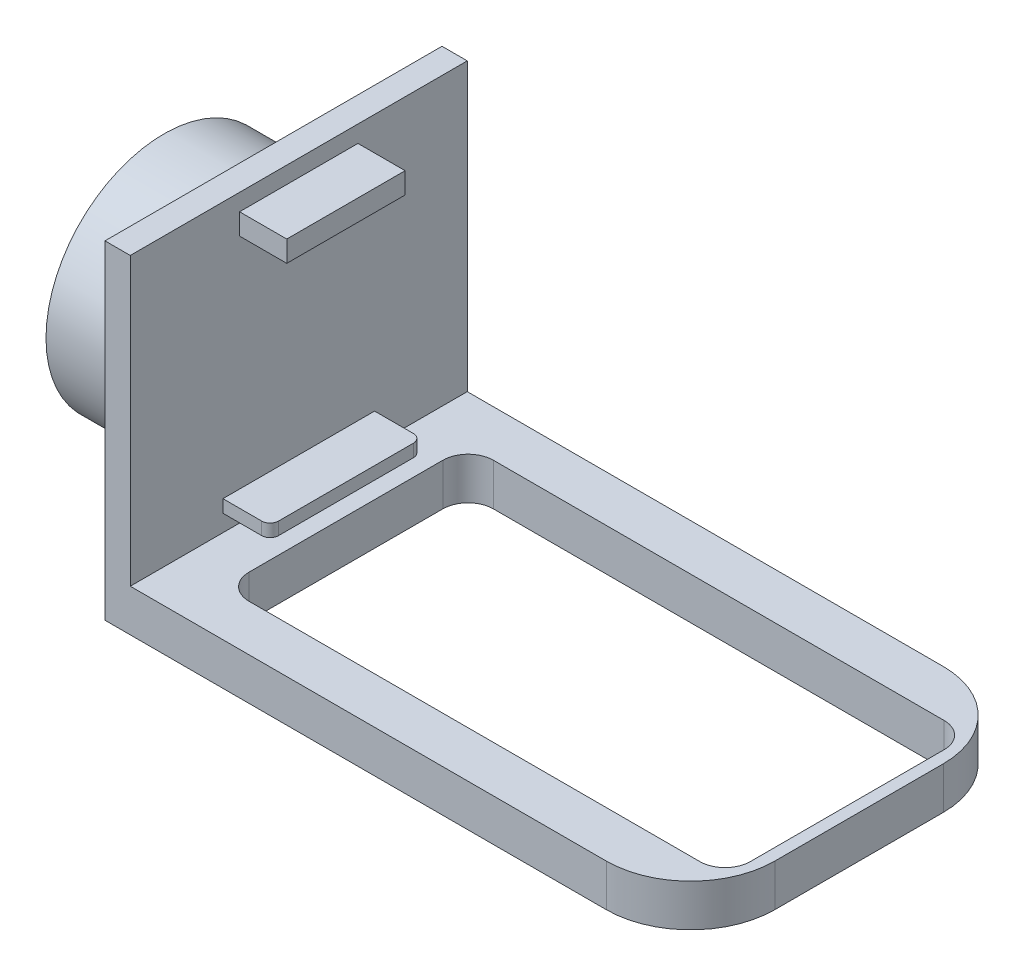
ISO-10303-21;
HEADER;
FILE_DESCRIPTION(('STEP AP214'),'2;1');
FILE_NAME('part.step','',(''),(''),'','','');
FILE_SCHEMA(('AUTOMOTIVE_DESIGN { 1 0 10303 214 1 1 1 1 }'));
ENDSEC;
DATA;
#1=APPLICATION_CONTEXT('core data for automotive mechanical design processes');
#2=APPLICATION_PROTOCOL_DEFINITION('international standard','automotive_design',2000,#1);
#3=PRODUCT_CONTEXT('',#1,'mechanical');
#4=PRODUCT('Part','Part','',(#3));
#5=PRODUCT_RELATED_PRODUCT_CATEGORY('part','',(#4));
#6=PRODUCT_DEFINITION_FORMATION('','',#4);
#7=PRODUCT_DEFINITION_CONTEXT('part definition',#1,'design');
#8=PRODUCT_DEFINITION('design','',#6,#7);
#9=PRODUCT_DEFINITION_SHAPE('','',#8);
#10=(LENGTH_UNIT() NAMED_UNIT(*) SI_UNIT(.MILLI.,.METRE.));
#11=(NAMED_UNIT(*) PLANE_ANGLE_UNIT() SI_UNIT($,.RADIAN.));
#12=(NAMED_UNIT(*) SI_UNIT($,.STERADIAN.) SOLID_ANGLE_UNIT());
#13=UNCERTAINTY_MEASURE_WITH_UNIT(LENGTH_MEASURE(1.E-05),#10,'distance_accuracy_value','');
#14=(GEOMETRIC_REPRESENTATION_CONTEXT(3) GLOBAL_UNCERTAINTY_ASSIGNED_CONTEXT((#13)) GLOBAL_UNIT_ASSIGNED_CONTEXT((#10,
#11,#12)) REPRESENTATION_CONTEXT('',''));
#15=CARTESIAN_POINT('',(0.,0.,0.));
#16=DIRECTION('',(0.,0.,1.));
#17=DIRECTION('',(1.,0.,0.));
#18=AXIS2_PLACEMENT_3D('',#15,#16,#17);
#19=CARTESIAN_POINT('',(-33.25,0.,0.));
#20=DIRECTION('',(-1.,0.,0.));
#21=DIRECTION('',(0.,0.,1.));
#22=AXIS2_PLACEMENT_3D('',#19,#20,#21);
#23=PLANE('',#22);
#24=DIRECTION('',(0.,-1.,0.));
#25=VECTOR('',#24,1.);
#26=CARTESIAN_POINT('',(-33.25,37.,7.025));
#27=LINE('',#26,#25);
#28=CARTESIAN_POINT('',(-33.25,37.,7.025));
#29=VERTEX_POINT('',#28);
#30=CARTESIAN_POINT('',(-33.25,34.5,7.025));
#31=VERTEX_POINT('',#30);
#32=EDGE_CURVE('E235',#29,#31,#27,.T.);
#33=ORIENTED_EDGE('',*,*,#32,.F.);
#34=DIRECTION('',(0.,0.,1.));
#35=VECTOR('',#34,1.);
#36=CARTESIAN_POINT('',(-33.25,37.,0.));
#37=LINE('',#36,#35);
#38=CARTESIAN_POINT('',(-33.25,37.,-7.025));
#39=VERTEX_POINT('',#38);
#40=EDGE_CURVE('E251',#39,#29,#37,.T.);
#41=ORIENTED_EDGE('',*,*,#40,.F.);
#42=DIRECTION('',(0.,1.,0.));
#43=VECTOR('',#42,1.);
#44=CARTESIAN_POINT('',(-33.25,34.5,-7.025));
#45=LINE('',#44,#43);
#46=CARTESIAN_POINT('',(-33.25,34.5,-7.025));
#47=VERTEX_POINT('',#46);
#48=EDGE_CURVE('E261',#47,#39,#45,.T.);
#49=ORIENTED_EDGE('',*,*,#48,.F.);
#50=DIRECTION('',(0.,0.,-1.));
#51=VECTOR('',#50,1.);
#52=CARTESIAN_POINT('',(-33.25,34.5,7.025));
#53=LINE('',#52,#51);
#54=EDGE_CURVE('E239',#31,#47,#53,.T.);
#55=ORIENTED_EDGE('',*,*,#54,.F.);
#56=EDGE_LOOP('',(#33,#41,#49,#55));
#57=FACE_BOUND('',#56,.T.);
#58=DIRECTION('',(0.,0.,1.));
#59=VECTOR('',#58,1.);
#60=CARTESIAN_POINT('',(-33.25,5.,20.));
#61=LINE('',#60,#59);
#62=CARTESIAN_POINT('',(-33.25,5.,-20.));
#63=VERTEX_POINT('',#62);
#64=CARTESIAN_POINT('',(-33.25,5.,20.));
#65=VERTEX_POINT('',#64);
#66=EDGE_CURVE('E366',#63,#65,#61,.T.);
#67=ORIENTED_EDGE('',*,*,#66,.F.);
#68=DIRECTION('',(0.,-1.,0.));
#69=VECTOR('',#68,1.);
#70=CARTESIAN_POINT('',(-33.25,0.,-20.));
#71=LINE('',#70,#69);
#72=CARTESIAN_POINT('',(-33.25,39.,-20.));
#73=VERTEX_POINT('',#72);
#74=EDGE_CURVE('E282',#73,#63,#71,.T.);
#75=ORIENTED_EDGE('',*,*,#74,.F.);
#76=DIRECTION('',(0.,0.,-1.));
#77=VECTOR('',#76,1.);
#78=CARTESIAN_POINT('',(-33.25,39.,20.));
#79=LINE('',#78,#77);
#80=CARTESIAN_POINT('',(-33.25,39.,20.));
#81=VERTEX_POINT('',#80);
#82=EDGE_CURVE('E292',#81,#73,#79,.T.);
#83=ORIENTED_EDGE('',*,*,#82,.F.);
#84=DIRECTION('',(0.,1.,0.));
#85=VECTOR('',#84,1.);
#86=CARTESIAN_POINT('',(-33.25,0.,20.));
#87=LINE('',#86,#85);
#88=EDGE_CURVE('E277',#65,#81,#87,.T.);
#89=ORIENTED_EDGE('',*,*,#88,.F.);
#90=EDGE_LOOP('',(#67,#75,#83,#89));
#91=FACE_BOUND('',#90,.T.);
#92=DIRECTION('',(0.,0.,-1.));
#93=VECTOR('',#92,1.);
#94=CARTESIAN_POINT('',(-33.25,7.,0.));
#95=LINE('',#94,#93);
#96=CARTESIAN_POINT('',(-33.25,7.,9.));
#97=VERTEX_POINT('',#96);
#98=CARTESIAN_POINT('',(-33.25,7.,-9.));
#99=VERTEX_POINT('',#98);
#100=EDGE_CURVE('E215',#97,#99,#95,.T.);
#101=ORIENTED_EDGE('',*,*,#100,.F.);
#102=DIRECTION('',(0.,-1.,0.));
#103=VECTOR('',#102,1.);
#104=CARTESIAN_POINT('',(-33.25,8.5,9.));
#105=LINE('',#104,#103);
#106=CARTESIAN_POINT('',(-33.25,8.5,9.));
#107=VERTEX_POINT('',#106);
#108=EDGE_CURVE('E227',#107,#97,#105,.T.);
#109=ORIENTED_EDGE('',*,*,#108,.F.);
#110=DIRECTION('',(0.,0.,1.));
#111=VECTOR('',#110,1.);
#112=CARTESIAN_POINT('',(-33.25,8.5,-9.));
#113=LINE('',#112,#111);
#114=CARTESIAN_POINT('',(-33.25,8.5,-9.));
#115=VERTEX_POINT('',#114);
#116=EDGE_CURVE('E236',#115,#107,#113,.T.);
#117=ORIENTED_EDGE('',*,*,#116,.F.);
#118=DIRECTION('',(0.,1.,0.));
#119=VECTOR('',#118,1.);
#120=CARTESIAN_POINT('',(-33.25,7.,-9.));
#121=LINE('',#120,#119);
#122=EDGE_CURVE('E230',#99,#115,#121,.T.);
#123=ORIENTED_EDGE('',*,*,#122,.F.);
#124=EDGE_LOOP('',(#101,#109,#117,#123));
#125=FACE_BOUND('',#124,.T.);
#126=ADVANCED_FACE('F34',(#57,#91,#125),#23,.F.);
#127=CARTESIAN_POINT('',(0.,5.,0.));
#128=DIRECTION('',(0.,-1.,0.));
#129=DIRECTION('',(0.,0.,-1.));
#130=AXIS2_PLACEMENT_3D('',#127,#128,#129);
#131=PLANE('',#130);
#132=DIRECTION('',(1.,0.,0.));
#133=VECTOR('',#132,1.);
#134=CARTESIAN_POINT('',(-33.25,5.,20.));
#135=LINE('',#134,#133);
#136=CARTESIAN_POINT('',(23.25,5.,20.));
#137=VERTEX_POINT('',#136);
#138=EDGE_CURVE('E369',#65,#137,#135,.T.);
#139=ORIENTED_EDGE('',*,*,#138,.T.);
#140=CARTESIAN_POINT('',(23.25,5.,10.));
#141=DIRECTION('',(0.,-1.,0.));
#142=DIRECTION('',(0.,0.,-1.));
#143=AXIS2_PLACEMENT_3D('',#140,#141,#142);
#144=CIRCLE('',#143,10.);
#145=CARTESIAN_POINT('',(33.25,5.,10.));
#146=VERTEX_POINT('',#145);
#147=EDGE_CURVE('E42',#137,#146,#144,.F.);
#148=ORIENTED_EDGE('',*,*,#147,.T.);
#149=DIRECTION('',(0.,0.,-1.));
#150=VECTOR('',#149,1.);
#151=CARTESIAN_POINT('',(33.25,5.,20.));
#152=LINE('',#151,#150);
#153=CARTESIAN_POINT('',(33.25,5.,-10.));
#154=VERTEX_POINT('',#153);
#155=EDGE_CURVE('E361',#146,#154,#152,.T.);
#156=ORIENTED_EDGE('',*,*,#155,.T.);
#157=CARTESIAN_POINT('',(23.25,5.,-10.));
#158=DIRECTION('',(0.,-1.,0.));
#159=DIRECTION('',(0.,0.,-1.));
#160=AXIS2_PLACEMENT_3D('',#157,#158,#159);
#161=CIRCLE('',#160,10.);
#162=CARTESIAN_POINT('',(23.25,5.,-20.));
#163=VERTEX_POINT('',#162);
#164=EDGE_CURVE('E49',#154,#163,#161,.F.);
#165=ORIENTED_EDGE('',*,*,#164,.T.);
#166=DIRECTION('',(-1.,0.,0.));
#167=VECTOR('',#166,1.);
#168=CARTESIAN_POINT('',(-33.25,5.,-20.));
#169=LINE('',#168,#167);
#170=EDGE_CURVE('E363',#163,#63,#169,.T.);
#171=ORIENTED_EDGE('',*,*,#170,.T.);
#172=ORIENTED_EDGE('',*,*,#66,.T.);
#173=EDGE_LOOP('',(#139,#148,#156,#165,#171,#172));
#174=FACE_BOUND('',#173,.T.);
#175=CARTESIAN_POINT('',(28.85,5.,11.5));
#176=DIRECTION('',(0.,1.,0.));
#177=DIRECTION('',(0.,0.,-1.));
#178=AXIS2_PLACEMENT_3D('',#175,#176,#177);
#179=CIRCLE('',#178,3.);
#180=CARTESIAN_POINT('',(28.85,5.,14.5));
#181=VERTEX_POINT('',#180);
#182=CARTESIAN_POINT('',(31.85,5.,11.5));
#183=VERTEX_POINT('',#182);
#184=EDGE_CURVE('E302',#181,#183,#179,.T.);
#185=ORIENTED_EDGE('',*,*,#184,.F.);
#186=DIRECTION('',(1.,0.,0.));
#187=VECTOR('',#186,1.);
#188=CARTESIAN_POINT('',(28.85,5.,14.5));
#189=LINE('',#188,#187);
#190=CARTESIAN_POINT('',(-24.65,5.,14.5));
#191=VERTEX_POINT('',#190);
#192=EDGE_CURVE('E318',#191,#181,#189,.T.);
#193=ORIENTED_EDGE('',*,*,#192,.F.);
#194=CARTESIAN_POINT('',(-24.65,5.,11.5));
#195=DIRECTION('',(0.,1.,0.));
#196=DIRECTION('',(0.,0.,1.));
#197=AXIS2_PLACEMENT_3D('',#194,#195,#196);
#198=CIRCLE('',#197,3.);
#199=CARTESIAN_POINT('',(-27.65,5.,11.5));
#200=VERTEX_POINT('',#199);
#201=EDGE_CURVE('E315',#200,#191,#198,.T.);
#202=ORIENTED_EDGE('',*,*,#201,.F.);
#203=DIRECTION('',(0.,0.,1.));
#204=VECTOR('',#203,1.);
#205=CARTESIAN_POINT('',(-27.65,5.,-11.5));
#206=LINE('',#205,#204);
#207=CARTESIAN_POINT('',(-27.65,5.,-11.5));
#208=VERTEX_POINT('',#207);
#209=EDGE_CURVE('E313',#208,#200,#206,.T.);
#210=ORIENTED_EDGE('',*,*,#209,.F.);
#211=CARTESIAN_POINT('',(-24.65,5.,-11.5));
#212=DIRECTION('',(0.,1.,0.));
#213=DIRECTION('',(0.,0.,-1.));
#214=AXIS2_PLACEMENT_3D('',#211,#212,#213);
#215=CIRCLE('',#214,3.);
#216=CARTESIAN_POINT('',(-24.65,5.,-14.5));
#217=VERTEX_POINT('',#216);
#218=EDGE_CURVE('E311',#217,#208,#215,.T.);
#219=ORIENTED_EDGE('',*,*,#218,.F.);
#220=DIRECTION('',(-1.,0.,0.));
#221=VECTOR('',#220,1.);
#222=CARTESIAN_POINT('',(-24.65,5.,-14.5));
#223=LINE('',#222,#221);
#224=CARTESIAN_POINT('',(28.85,5.,-14.5));
#225=VERTEX_POINT('',#224);
#226=EDGE_CURVE('E309',#225,#217,#223,.T.);
#227=ORIENTED_EDGE('',*,*,#226,.F.);
#228=CARTESIAN_POINT('',(28.85,5.,-11.5));
#229=DIRECTION('',(0.,1.,0.));
#230=DIRECTION('',(0.,0.,-1.));
#231=AXIS2_PLACEMENT_3D('',#228,#229,#230);
#232=CIRCLE('',#231,3.);
#233=CARTESIAN_POINT('',(31.85,5.,-11.5));
#234=VERTEX_POINT('',#233);
#235=EDGE_CURVE('E307',#234,#225,#232,.T.);
#236=ORIENTED_EDGE('',*,*,#235,.F.);
#237=DIRECTION('',(0.,0.,-1.));
#238=VECTOR('',#237,1.);
#239=CARTESIAN_POINT('',(31.85,5.,-11.5));
#240=LINE('',#239,#238);
#241=EDGE_CURVE('E304',#183,#234,#240,.T.);
#242=ORIENTED_EDGE('',*,*,#241,.F.);
#243=EDGE_LOOP('',(#185,#193,#202,#210,#219,#227,#236,#242));
#244=FACE_BOUND('',#243,.T.);
#245=ADVANCED_FACE('F405',(#174,#244),#131,.F.);
#246=CARTESIAN_POINT('',(0.,0.,0.));
#247=DIRECTION('',(0.,-1.,0.));
#248=DIRECTION('',(0.,0.,-1.));
#249=AXIS2_PLACEMENT_3D('',#246,#247,#248);
#250=PLANE('',#249);
#251=DIRECTION('',(0.,0.,-1.));
#252=VECTOR('',#251,1.);
#253=CARTESIAN_POINT('',(33.25,0.,20.));
#254=LINE('',#253,#252);
#255=CARTESIAN_POINT('',(33.25,0.,10.));
#256=VERTEX_POINT('',#255);
#257=CARTESIAN_POINT('',(33.25,0.,-10.));
#258=VERTEX_POINT('',#257);
#259=EDGE_CURVE('E360',#256,#258,#254,.T.);
#260=ORIENTED_EDGE('',*,*,#259,.F.);
#261=CARTESIAN_POINT('',(23.25,0.,10.));
#262=DIRECTION('',(0.,-1.,0.));
#263=DIRECTION('',(0.,0.,-1.));
#264=AXIS2_PLACEMENT_3D('',#261,#262,#263);
#265=CIRCLE('',#264,10.);
#266=CARTESIAN_POINT('',(23.25,0.,20.));
#267=VERTEX_POINT('',#266);
#268=EDGE_CURVE('E400',#256,#267,#265,.T.);
#269=ORIENTED_EDGE('',*,*,#268,.T.);
#270=DIRECTION('',(1.,0.,0.));
#271=VECTOR('',#270,1.);
#272=CARTESIAN_POINT('',(-33.25,0.,20.));
#273=LINE('',#272,#271);
#274=CARTESIAN_POINT('',(-36.25,0.,20.));
#275=VERTEX_POINT('',#274);
#276=EDGE_CURVE('E364',#275,#267,#273,.T.);
#277=ORIENTED_EDGE('',*,*,#276,.F.);
#278=DIRECTION('',(0.,0.,1.));
#279=VECTOR('',#278,1.);
#280=CARTESIAN_POINT('',(-36.25,0.,20.));
#281=LINE('',#280,#279);
#282=CARTESIAN_POINT('',(-36.25,0.,-20.));
#283=VERTEX_POINT('',#282);
#284=EDGE_CURVE('E287',#283,#275,#281,.T.);
#285=ORIENTED_EDGE('',*,*,#284,.F.);
#286=DIRECTION('',(-1.,0.,0.));
#287=VECTOR('',#286,1.);
#288=CARTESIAN_POINT('',(-33.25,0.,-20.));
#289=LINE('',#288,#287);
#290=CARTESIAN_POINT('',(23.25,0.,-20.));
#291=VERTEX_POINT('',#290);
#292=EDGE_CURVE('E374',#291,#283,#289,.T.);
#293=ORIENTED_EDGE('',*,*,#292,.F.);
#294=CARTESIAN_POINT('',(23.25,0.,-10.));
#295=DIRECTION('',(0.,-1.,0.));
#296=DIRECTION('',(0.,0.,-1.));
#297=AXIS2_PLACEMENT_3D('',#294,#295,#296);
#298=CIRCLE('',#297,10.);
#299=EDGE_CURVE('E398',#291,#258,#298,.T.);
#300=ORIENTED_EDGE('',*,*,#299,.T.);
#301=EDGE_LOOP('',(#260,#269,#277,#285,#293,#300));
#302=FACE_BOUND('',#301,.T.);
#303=DIRECTION('',(1.,0.,0.));
#304=VECTOR('',#303,1.);
#305=CARTESIAN_POINT('',(28.85,0.,14.5));
#306=LINE('',#305,#304);
#307=CARTESIAN_POINT('',(-24.65,0.,14.5));
#308=VERTEX_POINT('',#307);
#309=CARTESIAN_POINT('',(28.85,0.,14.5));
#310=VERTEX_POINT('',#309);
#311=EDGE_CURVE('E305',#308,#310,#306,.T.);
#312=ORIENTED_EDGE('',*,*,#311,.T.);
#313=CARTESIAN_POINT('',(28.85,0.,11.5));
#314=DIRECTION('',(0.,1.,0.));
#315=DIRECTION('',(0.,0.,-1.));
#316=AXIS2_PLACEMENT_3D('',#313,#314,#315);
#317=CIRCLE('',#316,3.);
#318=CARTESIAN_POINT('',(31.85,0.,11.5));
#319=VERTEX_POINT('',#318);
#320=EDGE_CURVE('E301',#310,#319,#317,.T.);
#321=ORIENTED_EDGE('',*,*,#320,.T.);
#322=DIRECTION('',(0.,0.,-1.));
#323=VECTOR('',#322,1.);
#324=CARTESIAN_POINT('',(31.85,0.,-11.5));
#325=LINE('',#324,#323);
#326=CARTESIAN_POINT('',(31.85,0.,-11.5));
#327=VERTEX_POINT('',#326);
#328=EDGE_CURVE('E323',#319,#327,#325,.T.);
#329=ORIENTED_EDGE('',*,*,#328,.T.);
#330=CARTESIAN_POINT('',(28.85,0.,-11.5));
#331=DIRECTION('',(0.,1.,0.));
#332=DIRECTION('',(0.,0.,-1.));
#333=AXIS2_PLACEMENT_3D('',#330,#331,#332);
#334=CIRCLE('',#333,3.);
#335=CARTESIAN_POINT('',(28.85,0.,-14.5));
#336=VERTEX_POINT('',#335);
#337=EDGE_CURVE('E326',#327,#336,#334,.T.);
#338=ORIENTED_EDGE('',*,*,#337,.T.);
#339=DIRECTION('',(-1.,0.,0.));
#340=VECTOR('',#339,1.);
#341=CARTESIAN_POINT('',(-24.65,0.,-14.5));
#342=LINE('',#341,#340);
#343=CARTESIAN_POINT('',(-24.65,0.,-14.5));
#344=VERTEX_POINT('',#343);
#345=EDGE_CURVE('E329',#336,#344,#342,.T.);
#346=ORIENTED_EDGE('',*,*,#345,.T.);
#347=CARTESIAN_POINT('',(-24.65,0.,-11.5));
#348=DIRECTION('',(0.,1.,0.));
#349=DIRECTION('',(0.,0.,-1.));
#350=AXIS2_PLACEMENT_3D('',#347,#348,#349);
#351=CIRCLE('',#350,3.);
#352=CARTESIAN_POINT('',(-27.65,0.,-11.5));
#353=VERTEX_POINT('',#352);
#354=EDGE_CURVE('E332',#344,#353,#351,.T.);
#355=ORIENTED_EDGE('',*,*,#354,.T.);
#356=DIRECTION('',(0.,0.,1.));
#357=VECTOR('',#356,1.);
#358=CARTESIAN_POINT('',(-27.65,0.,-11.5));
#359=LINE('',#358,#357);
#360=CARTESIAN_POINT('',(-27.65,0.,11.5));
#361=VERTEX_POINT('',#360);
#362=EDGE_CURVE('E335',#353,#361,#359,.T.);
#363=ORIENTED_EDGE('',*,*,#362,.T.);
#364=CARTESIAN_POINT('',(-24.65,0.,11.5));
#365=DIRECTION('',(0.,1.,0.));
#366=DIRECTION('',(0.,0.,1.));
#367=AXIS2_PLACEMENT_3D('',#364,#365,#366);
#368=CIRCLE('',#367,3.);
#369=EDGE_CURVE('E338',#361,#308,#368,.T.);
#370=ORIENTED_EDGE('',*,*,#369,.T.);
#371=EDGE_LOOP('',(#312,#321,#329,#338,#346,#355,#363,#370));
#372=FACE_BOUND('',#371,.T.);
#373=ADVANCED_FACE('F415',(#302,#372),#250,.T.);
#374=CARTESIAN_POINT('',(33.25,5.,20.));
#375=DIRECTION('',(-1.,0.,0.));
#376=DIRECTION('',(0.,0.,1.));
#377=AXIS2_PLACEMENT_3D('',#374,#375,#376);
#378=PLANE('',#377);
#379=ORIENTED_EDGE('',*,*,#155,.F.);
#380=DIRECTION('',(0.,-1.,0.));
#381=VECTOR('',#380,1.);
#382=CARTESIAN_POINT('',(33.25,5.,10.));
#383=LINE('',#382,#381);
#384=EDGE_CURVE('E395',#146,#256,#383,.T.);
#385=ORIENTED_EDGE('',*,*,#384,.T.);
#386=ORIENTED_EDGE('',*,*,#259,.T.);
#387=DIRECTION('',(0.,-1.,0.));
#388=VECTOR('',#387,1.);
#389=CARTESIAN_POINT('',(33.25,5.,-10.));
#390=LINE('',#389,#388);
#391=EDGE_CURVE('E393',#258,#154,#390,.F.);
#392=ORIENTED_EDGE('',*,*,#391,.T.);
#393=EDGE_LOOP('',(#379,#385,#386,#392));
#394=FACE_BOUND('',#393,.T.);
#395=ADVANCED_FACE('F410',(#394),#378,.F.);
#396=CARTESIAN_POINT('',(-33.25,5.,-20.));
#397=DIRECTION('',(0.,0.,1.));
#398=DIRECTION('',(1.,0.,0.));
#399=AXIS2_PLACEMENT_3D('',#396,#397,#398);
#400=PLANE('',#399);
#401=ORIENTED_EDGE('',*,*,#170,.F.);
#402=DIRECTION('',(0.,-1.,0.));
#403=VECTOR('',#402,1.);
#404=CARTESIAN_POINT('',(23.25,5.,-20.));
#405=LINE('',#404,#403);
#406=EDGE_CURVE('E11',#163,#291,#405,.T.);
#407=ORIENTED_EDGE('',*,*,#406,.T.);
#408=ORIENTED_EDGE('',*,*,#292,.T.);
#409=DIRECTION('',(0.,-1.,0.));
#410=VECTOR('',#409,1.);
#411=CARTESIAN_POINT('',(-36.25,0.,-20.));
#412=LINE('',#411,#410);
#413=CARTESIAN_POINT('',(-36.25,39.,-20.));
#414=VERTEX_POINT('',#413);
#415=EDGE_CURVE('E284',#414,#283,#412,.T.);
#416=ORIENTED_EDGE('',*,*,#415,.F.);
#417=DIRECTION('',(1.,0.,0.));
#418=VECTOR('',#417,1.);
#419=CARTESIAN_POINT('',(-36.25,39.,-20.));
#420=LINE('',#419,#418);
#421=EDGE_CURVE('E290',#414,#73,#420,.T.);
#422=ORIENTED_EDGE('',*,*,#421,.T.);
#423=ORIENTED_EDGE('',*,*,#74,.T.);
#424=EDGE_LOOP('',(#401,#407,#408,#416,#422,#423));
#425=FACE_BOUND('',#424,.T.);
#426=ADVANCED_FACE('F427',(#425),#400,.F.);
#427=CARTESIAN_POINT('',(-33.25,5.,20.));
#428=DIRECTION('',(0.,0.,-1.));
#429=DIRECTION('',(-1.,0.,0.));
#430=AXIS2_PLACEMENT_3D('',#427,#428,#429);
#431=PLANE('',#430);
#432=ORIENTED_EDGE('',*,*,#276,.T.);
#433=DIRECTION('',(0.,-1.,0.));
#434=VECTOR('',#433,1.);
#435=CARTESIAN_POINT('',(23.25,5.,20.));
#436=LINE('',#435,#434);
#437=EDGE_CURVE('E57',#267,#137,#436,.F.);
#438=ORIENTED_EDGE('',*,*,#437,.T.);
#439=ORIENTED_EDGE('',*,*,#138,.F.);
#440=ORIENTED_EDGE('',*,*,#88,.T.);
#441=DIRECTION('',(1.,0.,0.));
#442=VECTOR('',#441,1.);
#443=CARTESIAN_POINT('',(-36.25,39.,20.));
#444=LINE('',#443,#442);
#445=CARTESIAN_POINT('',(-36.25,39.,20.));
#446=VERTEX_POINT('',#445);
#447=EDGE_CURVE('E298',#446,#81,#444,.T.);
#448=ORIENTED_EDGE('',*,*,#447,.F.);
#449=DIRECTION('',(0.,1.,0.));
#450=VECTOR('',#449,1.);
#451=CARTESIAN_POINT('',(-36.25,0.,20.));
#452=LINE('',#451,#450);
#453=EDGE_CURVE('E278',#275,#446,#452,.T.);
#454=ORIENTED_EDGE('',*,*,#453,.F.);
#455=EDGE_LOOP('',(#432,#438,#439,#440,#448,#454));
#456=FACE_BOUND('',#455,.T.);
#457=ADVANCED_FACE('F419',(#456),#431,.F.);
#458=CARTESIAN_POINT('',(28.85,5.,11.5));
#459=DIRECTION('',(0.,-1.,0.));
#460=DIRECTION('',(0.,0.,-1.));
#461=AXIS2_PLACEMENT_3D('',#458,#459,#460);
#462=CYLINDRICAL_SURFACE('',#461,3.);
#463=ORIENTED_EDGE('',*,*,#320,.F.);
#464=DIRECTION('',(0.,-1.,0.));
#465=VECTOR('',#464,1.);
#466=CARTESIAN_POINT('',(28.85,5.,14.5));
#467=LINE('',#466,#465);
#468=EDGE_CURVE('E320',#181,#310,#467,.T.);
#469=ORIENTED_EDGE('',*,*,#468,.F.);
#470=ORIENTED_EDGE('',*,*,#184,.T.);
#471=DIRECTION('',(0.,-1.,0.));
#472=VECTOR('',#471,1.);
#473=CARTESIAN_POINT('',(31.85,5.,11.5));
#474=LINE('',#473,#472);
#475=EDGE_CURVE('E357',#183,#319,#474,.T.);
#476=ORIENTED_EDGE('',*,*,#475,.T.);
#477=EDGE_LOOP('',(#463,#469,#470,#476));
#478=FACE_BOUND('',#477,.T.);
#479=ADVANCED_FACE('F482',(#478),#462,.F.);
#480=CARTESIAN_POINT('',(31.85,5.,-11.5));
#481=DIRECTION('',(-1.,0.,0.));
#482=DIRECTION('',(0.,0.,1.));
#483=AXIS2_PLACEMENT_3D('',#480,#481,#482);
#484=PLANE('',#483);
#485=ORIENTED_EDGE('',*,*,#328,.F.);
#486=ORIENTED_EDGE('',*,*,#475,.F.);
#487=ORIENTED_EDGE('',*,*,#241,.T.);
#488=DIRECTION('',(0.,-1.,0.));
#489=VECTOR('',#488,1.);
#490=CARTESIAN_POINT('',(31.85,5.,-11.5));
#491=LINE('',#490,#489);
#492=EDGE_CURVE('E355',#234,#327,#491,.T.);
#493=ORIENTED_EDGE('',*,*,#492,.T.);
#494=EDGE_LOOP('',(#485,#486,#487,#493));
#495=FACE_BOUND('',#494,.T.);
#496=ADVANCED_FACE('F478',(#495),#484,.T.);
#497=CARTESIAN_POINT('',(28.85,5.,-11.5));
#498=DIRECTION('',(0.,-1.,0.));
#499=DIRECTION('',(0.,0.,-1.));
#500=AXIS2_PLACEMENT_3D('',#497,#498,#499);
#501=CYLINDRICAL_SURFACE('',#500,3.);
#502=ORIENTED_EDGE('',*,*,#337,.F.);
#503=ORIENTED_EDGE('',*,*,#492,.F.);
#504=ORIENTED_EDGE('',*,*,#235,.T.);
#505=DIRECTION('',(0.,-1.,0.));
#506=VECTOR('',#505,1.);
#507=CARTESIAN_POINT('',(28.85,5.,-14.5));
#508=LINE('',#507,#506);
#509=EDGE_CURVE('E353',#225,#336,#508,.T.);
#510=ORIENTED_EDGE('',*,*,#509,.T.);
#511=EDGE_LOOP('',(#502,#503,#504,#510));
#512=FACE_BOUND('',#511,.T.);
#513=ADVANCED_FACE('F474',(#512),#501,.F.);
#514=CARTESIAN_POINT('',(-24.65,5.,-14.5));
#515=DIRECTION('',(0.,0.,1.));
#516=DIRECTION('',(1.,0.,0.));
#517=AXIS2_PLACEMENT_3D('',#514,#515,#516);
#518=PLANE('',#517);
#519=ORIENTED_EDGE('',*,*,#345,.F.);
#520=ORIENTED_EDGE('',*,*,#509,.F.);
#521=ORIENTED_EDGE('',*,*,#226,.T.);
#522=DIRECTION('',(0.,-1.,0.));
#523=VECTOR('',#522,1.);
#524=CARTESIAN_POINT('',(-24.65,5.,-14.5));
#525=LINE('',#524,#523);
#526=EDGE_CURVE('E351',#217,#344,#525,.T.);
#527=ORIENTED_EDGE('',*,*,#526,.T.);
#528=EDGE_LOOP('',(#519,#520,#521,#527));
#529=FACE_BOUND('',#528,.T.);
#530=ADVANCED_FACE('F470',(#529),#518,.T.);
#531=CARTESIAN_POINT('',(-24.65,5.,-11.5));
#532=DIRECTION('',(0.,-1.,0.));
#533=DIRECTION('',(0.,0.,-1.));
#534=AXIS2_PLACEMENT_3D('',#531,#532,#533);
#535=CYLINDRICAL_SURFACE('',#534,3.);
#536=ORIENTED_EDGE('',*,*,#354,.F.);
#537=ORIENTED_EDGE('',*,*,#526,.F.);
#538=ORIENTED_EDGE('',*,*,#218,.T.);
#539=DIRECTION('',(0.,-1.,0.));
#540=VECTOR('',#539,1.);
#541=CARTESIAN_POINT('',(-27.65,5.,-11.5));
#542=LINE('',#541,#540);
#543=EDGE_CURVE('E349',#208,#353,#542,.T.);
#544=ORIENTED_EDGE('',*,*,#543,.T.);
#545=EDGE_LOOP('',(#536,#537,#538,#544));
#546=FACE_BOUND('',#545,.T.);
#547=ADVANCED_FACE('F466',(#546),#535,.F.);
#548=CARTESIAN_POINT('',(-27.65,5.,-11.5));
#549=DIRECTION('',(1.,0.,0.));
#550=DIRECTION('',(0.,0.,-1.));
#551=AXIS2_PLACEMENT_3D('',#548,#549,#550);
#552=PLANE('',#551);
#553=ORIENTED_EDGE('',*,*,#362,.F.);
#554=ORIENTED_EDGE('',*,*,#543,.F.);
#555=ORIENTED_EDGE('',*,*,#209,.T.);
#556=DIRECTION('',(0.,-1.,0.));
#557=VECTOR('',#556,1.);
#558=CARTESIAN_POINT('',(-27.65,5.,11.5));
#559=LINE('',#558,#557);
#560=EDGE_CURVE('E347',#200,#361,#559,.T.);
#561=ORIENTED_EDGE('',*,*,#560,.T.);
#562=EDGE_LOOP('',(#553,#554,#555,#561));
#563=FACE_BOUND('',#562,.T.);
#564=ADVANCED_FACE('F462',(#563),#552,.T.);
#565=CARTESIAN_POINT('',(-24.65,5.,11.5));
#566=DIRECTION('',(0.,-1.,0.));
#567=DIRECTION('',(0.,0.,-1.));
#568=AXIS2_PLACEMENT_3D('',#565,#566,#567);
#569=CYLINDRICAL_SURFACE('',#568,3.);
#570=ORIENTED_EDGE('',*,*,#369,.F.);
#571=ORIENTED_EDGE('',*,*,#560,.F.);
#572=ORIENTED_EDGE('',*,*,#201,.T.);
#573=DIRECTION('',(0.,-1.,0.));
#574=VECTOR('',#573,1.);
#575=CARTESIAN_POINT('',(-24.65,5.,14.5));
#576=LINE('',#575,#574);
#577=EDGE_CURVE('E345',#191,#308,#576,.T.);
#578=ORIENTED_EDGE('',*,*,#577,.T.);
#579=EDGE_LOOP('',(#570,#571,#572,#578));
#580=FACE_BOUND('',#579,.T.);
#581=ADVANCED_FACE('F458',(#580),#569,.F.);
#582=CARTESIAN_POINT('',(28.85,5.,14.5));
#583=DIRECTION('',(0.,0.,-1.));
#584=DIRECTION('',(-1.,0.,0.));
#585=AXIS2_PLACEMENT_3D('',#582,#583,#584);
#586=PLANE('',#585);
#587=ORIENTED_EDGE('',*,*,#311,.F.);
#588=ORIENTED_EDGE('',*,*,#577,.F.);
#589=ORIENTED_EDGE('',*,*,#192,.T.);
#590=ORIENTED_EDGE('',*,*,#468,.T.);
#591=EDGE_LOOP('',(#587,#588,#589,#590));
#592=FACE_BOUND('',#591,.T.);
#593=ADVANCED_FACE('F454',(#592),#586,.T.);
#594=CARTESIAN_POINT('',(-36.25,39.,20.));
#595=DIRECTION('',(0.,-1.,0.));
#596=DIRECTION('',(0.,0.,-1.));
#597=AXIS2_PLACEMENT_3D('',#594,#595,#596);
#598=PLANE('',#597);
#599=ORIENTED_EDGE('',*,*,#82,.T.);
#600=ORIENTED_EDGE('',*,*,#421,.F.);
#601=DIRECTION('',(0.,0.,-1.));
#602=VECTOR('',#601,1.);
#603=CARTESIAN_POINT('',(-36.25,39.,20.));
#604=LINE('',#603,#602);
#605=EDGE_CURVE('E281',#446,#414,#604,.T.);
#606=ORIENTED_EDGE('',*,*,#605,.F.);
#607=ORIENTED_EDGE('',*,*,#447,.T.);
#608=EDGE_LOOP('',(#599,#600,#606,#607));
#609=FACE_BOUND('',#608,.T.);
#610=ADVANCED_FACE('F451',(#609),#598,.F.);
#611=CARTESIAN_POINT('',(-36.25,0.,0.));
#612=DIRECTION('',(-1.,0.,0.));
#613=DIRECTION('',(0.,0.,1.));
#614=AXIS2_PLACEMENT_3D('',#611,#612,#613);
#615=PLANE('',#614);
#616=CARTESIAN_POINT('',(-36.25,19.5,0.));
#617=DIRECTION('',(-1.,0.,0.));
#618=DIRECTION('',(0.,0.,1.));
#619=AXIS2_PLACEMENT_3D('',#616,#617,#618);
#620=CIRCLE('',#619,4.);
#621=CARTESIAN_POINT('',(-36.25,19.5,4.));
#622=VERTEX_POINT('',#621);
#623=EDGE_CURVE('E572',#622,#622,#620,.T.);
#624=ORIENTED_EDGE('',*,*,#623,.F.);
#625=EDGE_LOOP('',(#624));
#626=FACE_BOUND('',#625,.T.);
#627=ORIENTED_EDGE('',*,*,#453,.T.);
#628=ORIENTED_EDGE('',*,*,#605,.T.);
#629=ORIENTED_EDGE('',*,*,#415,.T.);
#630=ORIENTED_EDGE('',*,*,#284,.T.);
#631=EDGE_LOOP('',(#627,#628,#629,#630));
#632=FACE_BOUND('',#631,.T.);
#633=ADVANCED_FACE('F422',(#626,#632),#615,.T.);
#634=CARTESIAN_POINT('',(-27.65,37.,7.025));
#635=DIRECTION('',(0.,0.,-1.));
#636=DIRECTION('',(-1.,0.,0.));
#637=AXIS2_PLACEMENT_3D('',#634,#635,#636);
#638=PLANE('',#637);
#639=ORIENTED_EDGE('',*,*,#32,.T.);
#640=DIRECTION('',(-1.,0.,0.));
#641=VECTOR('',#640,1.);
#642=CARTESIAN_POINT('',(-27.65,34.5,7.025));
#643=LINE('',#642,#641);
#644=CARTESIAN_POINT('',(-27.65,34.5,7.025));
#645=VERTEX_POINT('',#644);
#646=EDGE_CURVE('E274',#645,#31,#643,.T.);
#647=ORIENTED_EDGE('',*,*,#646,.F.);
#648=DIRECTION('',(0.,-1.,0.));
#649=VECTOR('',#648,1.);
#650=CARTESIAN_POINT('',(-27.65,37.,7.025));
#651=LINE('',#650,#649);
#652=CARTESIAN_POINT('',(-27.65,37.,7.025));
#653=VERTEX_POINT('',#652);
#654=EDGE_CURVE('E247',#653,#645,#651,.T.);
#655=ORIENTED_EDGE('',*,*,#654,.F.);
#656=DIRECTION('',(-1.,0.,0.));
#657=VECTOR('',#656,1.);
#658=CARTESIAN_POINT('',(-27.65,37.,7.025));
#659=LINE('',#658,#657);
#660=EDGE_CURVE('E257',#653,#29,#659,.T.);
#661=ORIENTED_EDGE('',*,*,#660,.T.);
#662=EDGE_LOOP('',(#639,#647,#655,#661));
#663=FACE_BOUND('',#662,.T.);
#664=ADVANCED_FACE('F554',(#663),#638,.F.);
#665=CARTESIAN_POINT('',(-27.65,34.5,7.025));
#666=DIRECTION('',(0.,1.,0.));
#667=DIRECTION('',(0.,0.,1.));
#668=AXIS2_PLACEMENT_3D('',#665,#666,#667);
#669=PLANE('',#668);
#670=ORIENTED_EDGE('',*,*,#54,.T.);
#671=DIRECTION('',(-1.,0.,0.));
#672=VECTOR('',#671,1.);
#673=CARTESIAN_POINT('',(-27.65,34.5,-7.025));
#674=LINE('',#673,#672);
#675=CARTESIAN_POINT('',(-27.65,34.5,-7.025));
#676=VERTEX_POINT('',#675);
#677=EDGE_CURVE('E271',#676,#47,#674,.T.);
#678=ORIENTED_EDGE('',*,*,#677,.F.);
#679=DIRECTION('',(0.,0.,-1.));
#680=VECTOR('',#679,1.);
#681=CARTESIAN_POINT('',(-27.65,34.5,7.025));
#682=LINE('',#681,#680);
#683=EDGE_CURVE('E250',#645,#676,#682,.T.);
#684=ORIENTED_EDGE('',*,*,#683,.F.);
#685=ORIENTED_EDGE('',*,*,#646,.T.);
#686=EDGE_LOOP('',(#670,#678,#684,#685));
#687=FACE_BOUND('',#686,.T.);
#688=ADVANCED_FACE('F551',(#687),#669,.F.);
#689=CARTESIAN_POINT('',(-27.65,34.5,-7.025));
#690=DIRECTION('',(0.,0.,1.));
#691=DIRECTION('',(1.,0.,0.));
#692=AXIS2_PLACEMENT_3D('',#689,#690,#691);
#693=PLANE('',#692);
#694=ORIENTED_EDGE('',*,*,#48,.T.);
#695=DIRECTION('',(-1.,0.,0.));
#696=VECTOR('',#695,1.);
#697=CARTESIAN_POINT('',(-27.65,37.,-7.025));
#698=LINE('',#697,#696);
#699=CARTESIAN_POINT('',(-27.65,37.,-7.025));
#700=VERTEX_POINT('',#699);
#701=EDGE_CURVE('E268',#700,#39,#698,.T.);
#702=ORIENTED_EDGE('',*,*,#701,.F.);
#703=DIRECTION('',(0.,1.,0.));
#704=VECTOR('',#703,1.);
#705=CARTESIAN_POINT('',(-27.65,34.5,-7.025));
#706=LINE('',#705,#704);
#707=EDGE_CURVE('E253',#676,#700,#706,.T.);
#708=ORIENTED_EDGE('',*,*,#707,.F.);
#709=ORIENTED_EDGE('',*,*,#677,.T.);
#710=EDGE_LOOP('',(#694,#702,#708,#709));
#711=FACE_BOUND('',#710,.T.);
#712=ADVANCED_FACE('F547',(#711),#693,.F.);
#713=CARTESIAN_POINT('',(-27.65,37.,0.));
#714=DIRECTION('',(0.,-1.,0.));
#715=DIRECTION('',(0.,0.,-1.));
#716=AXIS2_PLACEMENT_3D('',#713,#714,#715);
#717=PLANE('',#716);
#718=ORIENTED_EDGE('',*,*,#40,.T.);
#719=ORIENTED_EDGE('',*,*,#660,.F.);
#720=DIRECTION('',(0.,0.,-1.));
#721=VECTOR('',#720,1.);
#722=CARTESIAN_POINT('',(-27.65,37.,0.));
#723=LINE('',#722,#721);
#724=EDGE_CURVE('E255',#653,#700,#723,.T.);
#725=ORIENTED_EDGE('',*,*,#724,.T.);
#726=ORIENTED_EDGE('',*,*,#701,.T.);
#727=EDGE_LOOP('',(#718,#719,#725,#726));
#728=FACE_BOUND('',#727,.T.);
#729=ADVANCED_FACE('F543',(#728),#717,.F.);
#730=CARTESIAN_POINT('',(-27.65,0.,0.));
#731=DIRECTION('',(1.,0.,0.));
#732=DIRECTION('',(0.,0.,-1.));
#733=AXIS2_PLACEMENT_3D('',#730,#731,#732);
#734=PLANE('',#733);
#735=ORIENTED_EDGE('',*,*,#654,.T.);
#736=ORIENTED_EDGE('',*,*,#683,.T.);
#737=ORIENTED_EDGE('',*,*,#707,.T.);
#738=ORIENTED_EDGE('',*,*,#724,.F.);
#739=EDGE_LOOP('',(#735,#736,#737,#738));
#740=FACE_BOUND('',#739,.T.);
#741=ADVANCED_FACE('F535',(#740),#734,.T.);
#742=CARTESIAN_POINT('',(-27.65,7.,0.));
#743=DIRECTION('',(0.,1.,0.));
#744=DIRECTION('',(0.,0.,1.));
#745=AXIS2_PLACEMENT_3D('',#742,#743,#744);
#746=PLANE('',#745);
#747=DIRECTION('',(0.,0.,1.));
#748=VECTOR('',#747,1.);
#749=CARTESIAN_POINT('',(-27.65,7.,0.));
#750=LINE('',#749,#748);
#751=CARTESIAN_POINT('',(-27.65,7.00000000000001,-8.));
#752=VERTEX_POINT('',#751);
#753=CARTESIAN_POINT('',(-27.65,7.,8.));
#754=VERTEX_POINT('',#753);
#755=EDGE_CURVE('E231',#752,#754,#750,.T.);
#756=ORIENTED_EDGE('',*,*,#755,.T.);
#757=CARTESIAN_POINT('',(-28.65,7.,8.));
#758=DIRECTION('',(0.,1.,0.));
#759=DIRECTION('',(0.,0.,1.));
#760=AXIS2_PLACEMENT_3D('',#757,#758,#759);
#761=CIRCLE('',#760,1.);
#762=CARTESIAN_POINT('',(-28.65,7.,9.));
#763=VERTEX_POINT('',#762);
#764=EDGE_CURVE('E216',#754,#763,#761,.F.);
#765=ORIENTED_EDGE('',*,*,#764,.T.);
#766=DIRECTION('',(-1.,0.,0.));
#767=VECTOR('',#766,1.);
#768=CARTESIAN_POINT('',(-27.65,7.,9.));
#769=LINE('',#768,#767);
#770=EDGE_CURVE('E210',#763,#97,#769,.T.);
#771=ORIENTED_EDGE('',*,*,#770,.T.);
#772=ORIENTED_EDGE('',*,*,#100,.T.);
#773=DIRECTION('',(-1.,0.,0.));
#774=VECTOR('',#773,1.);
#775=CARTESIAN_POINT('',(-27.65,7.,-9.));
#776=LINE('',#775,#774);
#777=CARTESIAN_POINT('',(-28.65,7.,-9.));
#778=VERTEX_POINT('',#777);
#779=EDGE_CURVE('E512',#778,#99,#776,.T.);
#780=ORIENTED_EDGE('',*,*,#779,.F.);
#781=CARTESIAN_POINT('',(-28.65,7.,-8.));
#782=DIRECTION('',(0.,1.,0.));
#783=DIRECTION('',(0.,0.,1.));
#784=AXIS2_PLACEMENT_3D('',#781,#782,#783);
#785=CIRCLE('',#784,1.);
#786=EDGE_CURVE('E382',#778,#752,#785,.F.);
#787=ORIENTED_EDGE('',*,*,#786,.T.);
#788=EDGE_LOOP('',(#756,#765,#771,#772,#780,#787));
#789=FACE_BOUND('',#788,.T.);
#790=ADVANCED_FACE('F213',(#789),#746,.F.);
#791=CARTESIAN_POINT('',(-27.65,7.,-9.));
#792=DIRECTION('',(0.,0.,1.));
#793=DIRECTION('',(1.,0.,0.));
#794=AXIS2_PLACEMENT_3D('',#791,#792,#793);
#795=PLANE('',#794);
#796=DIRECTION('',(-1.,0.,0.));
#797=VECTOR('',#796,1.);
#798=CARTESIAN_POINT('',(-27.65,8.5,-9.));
#799=LINE('',#798,#797);
#800=CARTESIAN_POINT('',(-28.65,8.5,-9.));
#801=VERTEX_POINT('',#800);
#802=EDGE_CURVE('E519',#801,#115,#799,.T.);
#803=ORIENTED_EDGE('',*,*,#802,.F.);
#804=DIRECTION('',(0.,1.,0.));
#805=VECTOR('',#804,1.);
#806=CARTESIAN_POINT('',(-28.65,7.,-9.));
#807=LINE('',#806,#805);
#808=EDGE_CURVE('E391',#801,#778,#807,.F.);
#809=ORIENTED_EDGE('',*,*,#808,.T.);
#810=ORIENTED_EDGE('',*,*,#779,.T.);
#811=ORIENTED_EDGE('',*,*,#122,.T.);
#812=EDGE_LOOP('',(#803,#809,#810,#811));
#813=FACE_BOUND('',#812,.T.);
#814=ADVANCED_FACE('F527',(#813),#795,.F.);
#815=CARTESIAN_POINT('',(-27.65,8.5,-9.));
#816=DIRECTION('',(0.,-1.,0.));
#817=DIRECTION('',(0.,0.,-1.));
#818=AXIS2_PLACEMENT_3D('',#815,#816,#817);
#819=PLANE('',#818);
#820=DIRECTION('',(-1.,0.,0.));
#821=VECTOR('',#820,1.);
#822=CARTESIAN_POINT('',(-27.65,8.5,9.));
#823=LINE('',#822,#821);
#824=CARTESIAN_POINT('',(-28.65,8.5,9.));
#825=VERTEX_POINT('',#824);
#826=EDGE_CURVE('E221',#825,#107,#823,.T.);
#827=ORIENTED_EDGE('',*,*,#826,.F.);
#828=CARTESIAN_POINT('',(-28.65,8.5,8.));
#829=DIRECTION('',(0.,-1.,0.));
#830=DIRECTION('',(0.,0.,-1.));
#831=AXIS2_PLACEMENT_3D('',#828,#829,#830);
#832=CIRCLE('',#831,1.);
#833=CARTESIAN_POINT('',(-27.65,8.5,8.));
#834=VERTEX_POINT('',#833);
#835=EDGE_CURVE('E389',#825,#834,#832,.F.);
#836=ORIENTED_EDGE('',*,*,#835,.T.);
#837=DIRECTION('',(0.,0.,1.));
#838=VECTOR('',#837,1.);
#839=CARTESIAN_POINT('',(-27.65,8.5,-9.));
#840=LINE('',#839,#838);
#841=CARTESIAN_POINT('',(-27.65,8.5,-8.));
#842=VERTEX_POINT('',#841);
#843=EDGE_CURVE('E220',#842,#834,#840,.T.);
#844=ORIENTED_EDGE('',*,*,#843,.F.);
#845=CARTESIAN_POINT('',(-28.65,8.5,-8.));
#846=DIRECTION('',(0.,-1.,0.));
#847=DIRECTION('',(0.,0.,-1.));
#848=AXIS2_PLACEMENT_3D('',#845,#846,#847);
#849=CIRCLE('',#848,1.);
#850=EDGE_CURVE('E387',#842,#801,#849,.F.);
#851=ORIENTED_EDGE('',*,*,#850,.T.);
#852=ORIENTED_EDGE('',*,*,#802,.T.);
#853=ORIENTED_EDGE('',*,*,#116,.T.);
#854=EDGE_LOOP('',(#827,#836,#844,#851,#852,#853));
#855=FACE_BOUND('',#854,.T.);
#856=ADVANCED_FACE('F518',(#855),#819,.F.);
#857=CARTESIAN_POINT('',(-27.65,8.5,9.));
#858=DIRECTION('',(0.,0.,-1.));
#859=DIRECTION('',(-1.,0.,0.));
#860=AXIS2_PLACEMENT_3D('',#857,#858,#859);
#861=PLANE('',#860);
#862=ORIENTED_EDGE('',*,*,#770,.F.);
#863=DIRECTION('',(0.,-1.,0.));
#864=VECTOR('',#863,1.);
#865=CARTESIAN_POINT('',(-28.65,8.5,9.));
#866=LINE('',#865,#864);
#867=EDGE_CURVE('E385',#763,#825,#866,.F.);
#868=ORIENTED_EDGE('',*,*,#867,.T.);
#869=ORIENTED_EDGE('',*,*,#826,.T.);
#870=ORIENTED_EDGE('',*,*,#108,.T.);
#871=EDGE_LOOP('',(#862,#868,#869,#870));
#872=FACE_BOUND('',#871,.T.);
#873=ADVANCED_FACE('F233',(#872),#861,.F.);
#874=CARTESIAN_POINT('',(-27.65,0.,0.));
#875=DIRECTION('',(1.,0.,0.));
#876=DIRECTION('',(0.,0.,-1.));
#877=AXIS2_PLACEMENT_3D('',#874,#875,#876);
#878=PLANE('',#877);
#879=ORIENTED_EDGE('',*,*,#843,.T.);
#880=DIRECTION('',(0.,-1.,0.));
#881=VECTOR('',#880,1.);
#882=CARTESIAN_POINT('',(-27.65,7.,8.));
#883=LINE('',#882,#881);
#884=EDGE_CURVE('E379',#834,#754,#883,.T.);
#885=ORIENTED_EDGE('',*,*,#884,.T.);
#886=ORIENTED_EDGE('',*,*,#755,.F.);
#887=DIRECTION('',(0.,1.,0.));
#888=VECTOR('',#887,1.);
#889=CARTESIAN_POINT('',(-27.65,8.5,-8.));
#890=LINE('',#889,#888);
#891=EDGE_CURVE('E371',#752,#842,#890,.T.);
#892=ORIENTED_EDGE('',*,*,#891,.T.);
#893=EDGE_LOOP('',(#879,#885,#886,#892));
#894=FACE_BOUND('',#893,.T.);
#895=ADVANCED_FACE('F499',(#894),#878,.T.);
#896=CARTESIAN_POINT('',(-28.65,0.,8.));
#897=DIRECTION('',(0.,1.,0.));
#898=DIRECTION('',(0.,0.,1.));
#899=AXIS2_PLACEMENT_3D('',#896,#897,#898);
#900=CYLINDRICAL_SURFACE('',#899,1.);
#901=ORIENTED_EDGE('',*,*,#835,.F.);
#902=ORIENTED_EDGE('',*,*,#867,.F.);
#903=ORIENTED_EDGE('',*,*,#764,.F.);
#904=ORIENTED_EDGE('',*,*,#884,.F.);
#905=EDGE_LOOP('',(#901,#902,#903,#904));
#906=FACE_BOUND('',#905,.T.);
#907=ADVANCED_FACE('F495',(#906),#900,.T.);
#908=CARTESIAN_POINT('',(-28.65,0.,-8.));
#909=DIRECTION('',(0.,-1.,0.));
#910=DIRECTION('',(0.,0.,-1.));
#911=AXIS2_PLACEMENT_3D('',#908,#909,#910);
#912=CYLINDRICAL_SURFACE('',#911,1.);
#913=ORIENTED_EDGE('',*,*,#786,.F.);
#914=ORIENTED_EDGE('',*,*,#808,.F.);
#915=ORIENTED_EDGE('',*,*,#850,.F.);
#916=ORIENTED_EDGE('',*,*,#891,.F.);
#917=EDGE_LOOP('',(#913,#914,#915,#916));
#918=FACE_BOUND('',#917,.T.);
#919=ADVANCED_FACE('F498',(#918),#912,.T.);
#920=CARTESIAN_POINT('',(-39.25,19.5,0.));
#921=DIRECTION('',(1.,0.,0.));
#922=DIRECTION('',(0.,0.,-1.));
#923=AXIS2_PLACEMENT_3D('',#920,#921,#922);
#924=CYLINDRICAL_SURFACE('',#923,4.);
#925=CARTESIAN_POINT('',(-39.25,19.5,0.));
#926=DIRECTION('',(-1.,0.,0.));
#927=DIRECTION('',(0.,0.,1.));
#928=AXIS2_PLACEMENT_3D('',#925,#926,#927);
#929=CIRCLE('',#928,4.);
#930=CARTESIAN_POINT('',(-39.25,19.5,4.));
#931=VERTEX_POINT('',#930);
#932=EDGE_CURVE('E524',#931,#931,#929,.T.);
#933=ORIENTED_EDGE('',*,*,#932,.F.);
#934=EDGE_LOOP('',(#933));
#935=FACE_BOUND('',#934,.T.);
#936=ORIENTED_EDGE('',*,*,#623,.T.);
#937=EDGE_LOOP('',(#936));
#938=FACE_BOUND('',#937,.T.);
#939=ADVANCED_FACE('F439',(#935,#938),#924,.T.);
#940=CARTESIAN_POINT('',(23.25,5.,10.));
#941=DIRECTION('',(0.,-1.,0.));
#942=DIRECTION('',(0.,0.,-1.));
#943=AXIS2_PLACEMENT_3D('',#940,#941,#942);
#944=CYLINDRICAL_SURFACE('',#943,10.);
#945=ORIENTED_EDGE('',*,*,#147,.F.);
#946=ORIENTED_EDGE('',*,*,#437,.F.);
#947=ORIENTED_EDGE('',*,*,#268,.F.);
#948=ORIENTED_EDGE('',*,*,#384,.F.);
#949=EDGE_LOOP('',(#945,#946,#947,#948));
#950=FACE_BOUND('',#949,.T.);
#951=ADVANCED_FACE('F413',(#950),#944,.T.);
#952=CARTESIAN_POINT('',(23.25,5.,-10.));
#953=DIRECTION('',(0.,-1.,0.));
#954=DIRECTION('',(0.,0.,-1.));
#955=AXIS2_PLACEMENT_3D('',#952,#953,#954);
#956=CYLINDRICAL_SURFACE('',#955,10.);
#957=ORIENTED_EDGE('',*,*,#164,.F.);
#958=ORIENTED_EDGE('',*,*,#391,.F.);
#959=ORIENTED_EDGE('',*,*,#299,.F.);
#960=ORIENTED_EDGE('',*,*,#406,.F.);
#961=EDGE_LOOP('',(#957,#958,#959,#960));
#962=FACE_BOUND('',#961,.T.);
#963=ADVANCED_FACE('F36',(#962),#956,.T.);
#964=CARTESIAN_POINT('',(-49.25,19.5,0.));
#965=DIRECTION('',(1.,0.,0.));
#966=DIRECTION('',(0.,0.,-1.));
#967=AXIS2_PLACEMENT_3D('',#964,#965,#966);
#968=CYLINDRICAL_SURFACE('',#967,14.);
#969=CARTESIAN_POINT('',(-49.25,19.5,0.));
#970=DIRECTION('',(-1.,0.,0.));
#971=DIRECTION('',(0.,0.,1.));
#972=AXIS2_PLACEMENT_3D('',#969,#970,#971);
#973=CIRCLE('',#972,14.);
#974=CARTESIAN_POINT('',(-49.25,19.5,14.));
#975=VERTEX_POINT('',#974);
#976=EDGE_CURVE('E574',#975,#975,#973,.T.);
#977=ORIENTED_EDGE('',*,*,#976,.F.);
#978=EDGE_LOOP('',(#977));
#979=FACE_BOUND('',#978,.T.);
#980=CARTESIAN_POINT('',(-39.25,19.5,0.));
#981=DIRECTION('',(-1.,0.,0.));
#982=DIRECTION('',(0.,0.,1.));
#983=AXIS2_PLACEMENT_3D('',#980,#981,#982);
#984=CIRCLE('',#983,14.);
#985=CARTESIAN_POINT('',(-39.25,19.5,14.));
#986=VERTEX_POINT('',#985);
#987=EDGE_CURVE('E578',#986,#986,#984,.T.);
#988=ORIENTED_EDGE('',*,*,#987,.T.);
#989=EDGE_LOOP('',(#988));
#990=FACE_BOUND('',#989,.T.);
#991=ADVANCED_FACE('F431',(#979,#990),#968,.T.);
#992=CARTESIAN_POINT('',(-49.25,19.5,0.));
#993=DIRECTION('',(-1.,0.,0.));
#994=DIRECTION('',(0.,0.,1.));
#995=AXIS2_PLACEMENT_3D('',#992,#993,#994);
#996=PLANE('',#995);
#997=CARTESIAN_POINT('',(-49.25,19.5,0.));
#998=DIRECTION('',(-1.,0.,0.));
#999=DIRECTION('',(0.,0.,1.));
#1000=AXIS2_PLACEMENT_3D('',#997,#998,#999);
#1001=CIRCLE('',#1000,5.);
#1002=CARTESIAN_POINT('',(-49.25,19.5,5.));
#1003=VERTEX_POINT('',#1002);
#1004=EDGE_CURVE('E584',#1003,#1003,#1001,.T.);
#1005=ORIENTED_EDGE('',*,*,#1004,.F.);
#1006=EDGE_LOOP('',(#1005));
#1007=FACE_BOUND('',#1006,.T.);
#1008=ORIENTED_EDGE('',*,*,#976,.T.);
#1009=EDGE_LOOP('',(#1008));
#1010=FACE_BOUND('',#1009,.T.);
#1011=ADVANCED_FACE('F436',(#1007,#1010),#996,.T.);
#1012=CARTESIAN_POINT('',(-39.25,19.5,0.));
#1013=DIRECTION('',(-1.,0.,0.));
#1014=DIRECTION('',(0.,0.,1.));
#1015=AXIS2_PLACEMENT_3D('',#1012,#1013,#1014);
#1016=PLANE('',#1015);
#1017=ORIENTED_EDGE('',*,*,#932,.T.);
#1018=EDGE_LOOP('',(#1017));
#1019=FACE_BOUND('',#1018,.T.);
#1020=ORIENTED_EDGE('',*,*,#987,.F.);
#1021=EDGE_LOOP('',(#1020));
#1022=FACE_BOUND('',#1021,.T.);
#1023=ADVANCED_FACE('F613',(#1019,#1022),#1016,.F.);
#1024=CARTESIAN_POINT('',(-44.25,19.5,0.));
#1025=DIRECTION('',(-1.,0.,0.));
#1026=DIRECTION('',(0.,0.,1.));
#1027=AXIS2_PLACEMENT_3D('',#1024,#1025,#1026);
#1028=CYLINDRICAL_SURFACE('',#1027,5.);
#1029=CARTESIAN_POINT('',(-44.25,19.5,0.));
#1030=DIRECTION('',(-1.,0.,0.));
#1031=DIRECTION('',(0.,0.,1.));
#1032=AXIS2_PLACEMENT_3D('',#1029,#1030,#1031);
#1033=CIRCLE('',#1032,5.);
#1034=CARTESIAN_POINT('',(-44.25,19.5,5.));
#1035=VERTEX_POINT('',#1034);
#1036=EDGE_CURVE('E582',#1035,#1035,#1033,.T.);
#1037=ORIENTED_EDGE('',*,*,#1036,.F.);
#1038=EDGE_LOOP('',(#1037));
#1039=FACE_BOUND('',#1038,.T.);
#1040=ORIENTED_EDGE('',*,*,#1004,.T.);
#1041=EDGE_LOOP('',(#1040));
#1042=FACE_BOUND('',#1041,.T.);
#1043=ADVANCED_FACE('F607',(#1039,#1042),#1028,.F.);
#1044=CARTESIAN_POINT('',(-44.25,19.5,0.));
#1045=DIRECTION('',(-1.,0.,0.));
#1046=DIRECTION('',(0.,0.,1.));
#1047=AXIS2_PLACEMENT_3D('',#1044,#1045,#1046);
#1048=PLANE('',#1047);
#1049=CARTESIAN_POINT('',(-44.25,19.5,0.));
#1050=DIRECTION('',(-1.,0.,0.));
#1051=DIRECTION('',(0.,0.,1.));
#1052=AXIS2_PLACEMENT_3D('',#1049,#1050,#1051);
#1053=CIRCLE('',#1052,2.25);
#1054=CARTESIAN_POINT('',(-44.25,19.5,2.25));
#1055=VERTEX_POINT('',#1054);
#1056=EDGE_CURVE('E590',#1055,#1055,#1053,.T.);
#1057=ORIENTED_EDGE('',*,*,#1056,.F.);
#1058=EDGE_LOOP('',(#1057));
#1059=FACE_BOUND('',#1058,.T.);
#1060=ORIENTED_EDGE('',*,*,#1036,.T.);
#1061=EDGE_LOOP('',(#1060));
#1062=FACE_BOUND('',#1061,.T.);
#1063=ADVANCED_FACE('F601',(#1059,#1062),#1048,.T.);
#1064=CARTESIAN_POINT('',(-41.25,19.5,0.));
#1065=DIRECTION('',(-1.,0.,0.));
#1066=DIRECTION('',(0.,0.,1.));
#1067=AXIS2_PLACEMENT_3D('',#1064,#1065,#1066);
#1068=CYLINDRICAL_SURFACE('',#1067,2.25);
#1069=CARTESIAN_POINT('',(-41.25,19.5,0.));
#1070=DIRECTION('',(-1.,0.,0.));
#1071=DIRECTION('',(0.,0.,1.));
#1072=AXIS2_PLACEMENT_3D('',#1069,#1070,#1071);
#1073=CIRCLE('',#1072,2.25);
#1074=CARTESIAN_POINT('',(-41.25,19.5,2.25));
#1075=VERTEX_POINT('',#1074);
#1076=EDGE_CURVE('E587',#1075,#1075,#1073,.T.);
#1077=ORIENTED_EDGE('',*,*,#1076,.F.);
#1078=EDGE_LOOP('',(#1077));
#1079=FACE_BOUND('',#1078,.T.);
#1080=ORIENTED_EDGE('',*,*,#1056,.T.);
#1081=EDGE_LOOP('',(#1080));
#1082=FACE_BOUND('',#1081,.T.);
#1083=ADVANCED_FACE('F598',(#1079,#1082),#1068,.F.);
#1084=CARTESIAN_POINT('',(-41.25,19.5,0.));
#1085=DIRECTION('',(-1.,0.,0.));
#1086=DIRECTION('',(0.,0.,1.));
#1087=AXIS2_PLACEMENT_3D('',#1084,#1085,#1086);
#1088=PLANE('',#1087);
#1089=ORIENTED_EDGE('',*,*,#1076,.T.);
#1090=EDGE_LOOP('',(#1089));
#1091=FACE_BOUND('',#1090,.T.);
#1092=ADVANCED_FACE('F596',(#1091),#1088,.T.);
#1093=CLOSED_SHELL('',(#126,#245,#373,#395,#426,#457,#479,#496,#513,#530,#547,#564,#581,#593,
#610,#633,#664,#688,#712,#729,#741,#790,#814,#856,#873,#895,#907,#919,#939,#951,#963,#991,#1011,
#1023,#1043,#1063,#1083,#1092));
#1094=MANIFOLD_SOLID_BREP('B2',#1093);
#1095=ADVANCED_BREP_SHAPE_REPRESENTATION('',(#18,#1094),#14);
#1096=SHAPE_DEFINITION_REPRESENTATION(#9,#1095);
ENDSEC;
END-ISO-10303-21;
